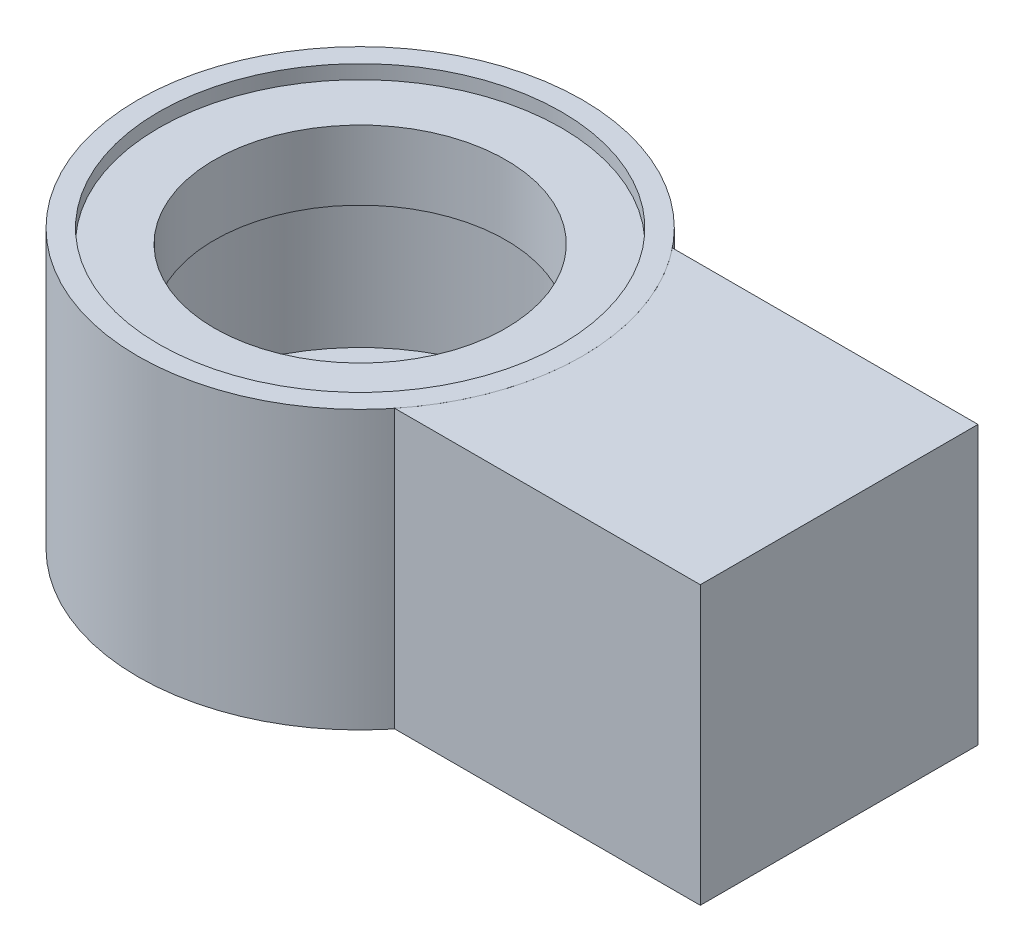
ISO-10303-21;
HEADER;
FILE_DESCRIPTION(('STEP AP214'),'2;1');
FILE_NAME('part.step','',(''),(''),'','','');
FILE_SCHEMA(('AUTOMOTIVE_DESIGN { 1 0 10303 214 1 1 1 1 }'));
ENDSEC;
DATA;
#1=APPLICATION_CONTEXT('core data for automotive mechanical design processes');
#2=APPLICATION_PROTOCOL_DEFINITION('international standard','automotive_design',2000,#1);
#3=PRODUCT_CONTEXT('',#1,'mechanical');
#4=PRODUCT('Part','Part','',(#3));
#5=PRODUCT_RELATED_PRODUCT_CATEGORY('part','',(#4));
#6=PRODUCT_DEFINITION_FORMATION('','',#4);
#7=PRODUCT_DEFINITION_CONTEXT('part definition',#1,'design');
#8=PRODUCT_DEFINITION('design','',#6,#7);
#9=PRODUCT_DEFINITION_SHAPE('','',#8);
#10=(LENGTH_UNIT() NAMED_UNIT(*) SI_UNIT(.MILLI.,.METRE.));
#11=(NAMED_UNIT(*) PLANE_ANGLE_UNIT() SI_UNIT($,.RADIAN.));
#12=(NAMED_UNIT(*) SI_UNIT($,.STERADIAN.) SOLID_ANGLE_UNIT());
#13=UNCERTAINTY_MEASURE_WITH_UNIT(LENGTH_MEASURE(1.E-05),#10,'distance_accuracy_value','');
#14=(GEOMETRIC_REPRESENTATION_CONTEXT(3) GLOBAL_UNCERTAINTY_ASSIGNED_CONTEXT((#13)) GLOBAL_UNIT_ASSIGNED_CONTEXT((#10,
#11,#12)) REPRESENTATION_CONTEXT('',''));
#15=CARTESIAN_POINT('',(0.,0.,0.));
#16=DIRECTION('',(0.,0.,1.));
#17=DIRECTION('',(1.,0.,0.));
#18=AXIS2_PLACEMENT_3D('',#15,#16,#17);
#19=CARTESIAN_POINT('',(175.26,101.6,30.48));
#20=DIRECTION('',(0.,0.,-1.));
#21=DIRECTION('',(0.,1.,0.));
#22=AXIS2_PLACEMENT_3D('',#19,#20,#21);
#23=PLANE('',#22);
#24=DIRECTION('',(-1.,0.,0.));
#25=VECTOR('',#24,1.);
#26=CARTESIAN_POINT('',(175.26,101.6,30.48));
#27=LINE('',#26,#25);
#28=CARTESIAN_POINT('',(175.26,101.6,30.48));
#29=VERTEX_POINT('',#28);
#30=CARTESIAN_POINT('',(63.4491796637277,101.6,30.48));
#31=VERTEX_POINT('',#30);
#32=EDGE_CURVE('E104',#29,#31,#27,.T.);
#33=ORIENTED_EDGE('',*,*,#32,.T.);
#34=DIRECTION('',(0.,1.,0.));
#35=VECTOR('',#34,1.);
#36=CARTESIAN_POINT('',(63.4491796637277,101.6,30.48));
#37=LINE('',#36,#35);
#38=CARTESIAN_POINT('',(63.4491796637277,0.,30.48));
#39=VERTEX_POINT('',#38);
#40=EDGE_CURVE('E99',#39,#31,#37,.T.);
#41=ORIENTED_EDGE('',*,*,#40,.F.);
#42=DIRECTION('',(-1.,0.,0.));
#43=VECTOR('',#42,1.);
#44=CARTESIAN_POINT('',(175.26,0.,30.48));
#45=LINE('',#44,#43);
#46=CARTESIAN_POINT('',(175.26,0.,30.48));
#47=VERTEX_POINT('',#46);
#48=EDGE_CURVE('E12',#47,#39,#45,.T.);
#49=ORIENTED_EDGE('',*,*,#48,.F.);
#50=DIRECTION('',(0.,-1.,0.));
#51=VECTOR('',#50,1.);
#52=CARTESIAN_POINT('',(175.26,101.6,30.48));
#53=LINE('',#52,#51);
#54=EDGE_CURVE('E109',#29,#47,#53,.T.);
#55=ORIENTED_EDGE('',*,*,#54,.F.);
#56=EDGE_LOOP('',(#33,#41,#49,#55));
#57=FACE_BOUND('',#56,.T.);
#58=ADVANCED_FACE('F47',(#57),#23,.F.);
#59=CARTESIAN_POINT('',(175.26,0.,30.48));
#60=DIRECTION('',(0.,1.,0.));
#61=DIRECTION('',(0.,0.,1.));
#62=AXIS2_PLACEMENT_3D('',#59,#60,#61);
#63=PLANE('',#62);
#64=ORIENTED_EDGE('',*,*,#48,.T.);
#65=CARTESIAN_POINT('',(0.,0.,-20.32));
#66=DIRECTION('',(0.,-1.,0.));
#67=DIRECTION('',(0.,0.,-1.));
#68=AXIS2_PLACEMENT_3D('',#65,#66,#67);
#69=CIRCLE('',#68,81.28);
#70=CARTESIAN_POINT('',(63.4491796637277,0.,-71.12));
#71=VERTEX_POINT('',#70);
#72=EDGE_CURVE('E89',#71,#39,#69,.T.);
#73=ORIENTED_EDGE('',*,*,#72,.F.);
#74=DIRECTION('',(-1.,0.,0.));
#75=VECTOR('',#74,1.);
#76=CARTESIAN_POINT('',(175.26,0.,-71.12));
#77=LINE('',#76,#75);
#78=CARTESIAN_POINT('',(175.26,0.,-71.12));
#79=VERTEX_POINT('',#78);
#80=EDGE_CURVE('E54',#79,#71,#77,.T.);
#81=ORIENTED_EDGE('',*,*,#80,.F.);
#82=DIRECTION('',(0.,0.,-1.));
#83=VECTOR('',#82,1.);
#84=CARTESIAN_POINT('',(175.26,0.,30.48));
#85=LINE('',#84,#83);
#86=EDGE_CURVE('E90',#47,#79,#85,.T.);
#87=ORIENTED_EDGE('',*,*,#86,.F.);
#88=EDGE_LOOP('',(#64,#73,#81,#87));
#89=FACE_BOUND('',#88,.T.);
#90=ADVANCED_FACE('F87',(#89),#63,.F.);
#91=CARTESIAN_POINT('',(175.26,101.6,-71.12));
#92=DIRECTION('',(0.,0.,1.));
#93=DIRECTION('',(0.,-1.,0.));
#94=AXIS2_PLACEMENT_3D('',#91,#92,#93);
#95=PLANE('',#94);
#96=ORIENTED_EDGE('',*,*,#80,.T.);
#97=DIRECTION('',(0.,1.,0.));
#98=VECTOR('',#97,1.);
#99=CARTESIAN_POINT('',(63.4491796637277,101.6,-71.12));
#100=LINE('',#99,#98);
#101=CARTESIAN_POINT('',(63.4491796637277,101.6,-71.12));
#102=VERTEX_POINT('',#101);
#103=EDGE_CURVE('E101',#102,#71,#100,.F.);
#104=ORIENTED_EDGE('',*,*,#103,.F.);
#105=DIRECTION('',(-1.,0.,0.));
#106=VECTOR('',#105,1.);
#107=CARTESIAN_POINT('',(175.26,101.6,-71.12));
#108=LINE('',#107,#106);
#109=CARTESIAN_POINT('',(175.26,101.6,-71.12));
#110=VERTEX_POINT('',#109);
#111=EDGE_CURVE('E116',#110,#102,#108,.T.);
#112=ORIENTED_EDGE('',*,*,#111,.F.);
#113=DIRECTION('',(0.,1.,0.));
#114=VECTOR('',#113,1.);
#115=CARTESIAN_POINT('',(175.26,101.6,-71.12));
#116=LINE('',#115,#114);
#117=EDGE_CURVE('E66',#79,#110,#116,.T.);
#118=ORIENTED_EDGE('',*,*,#117,.F.);
#119=EDGE_LOOP('',(#96,#104,#112,#118));
#120=FACE_BOUND('',#119,.T.);
#121=ADVANCED_FACE('F118',(#120),#95,.F.);
#122=CARTESIAN_POINT('',(175.26,101.6,30.48));
#123=DIRECTION('',(0.,-1.,0.));
#124=DIRECTION('',(0.,0.,-1.));
#125=AXIS2_PLACEMENT_3D('',#122,#123,#124);
#126=PLANE('',#125);
#127=ORIENTED_EDGE('',*,*,#111,.T.);
#128=CARTESIAN_POINT('',(0.,101.6,-20.32));
#129=DIRECTION('',(0.,1.,0.));
#130=DIRECTION('',(0.,0.,1.));
#131=AXIS2_PLACEMENT_3D('',#128,#129,#130);
#132=CIRCLE('',#131,81.28);
#133=EDGE_CURVE('E102',#31,#102,#132,.T.);
#134=ORIENTED_EDGE('',*,*,#133,.F.);
#135=ORIENTED_EDGE('',*,*,#32,.F.);
#136=DIRECTION('',(0.,0.,1.));
#137=VECTOR('',#136,1.);
#138=CARTESIAN_POINT('',(175.26,101.6,30.48));
#139=LINE('',#138,#137);
#140=EDGE_CURVE('E61',#110,#29,#139,.T.);
#141=ORIENTED_EDGE('',*,*,#140,.F.);
#142=EDGE_LOOP('',(#127,#134,#135,#141));
#143=FACE_BOUND('',#142,.T.);
#144=ADVANCED_FACE('F120',(#143),#126,.F.);
#145=CARTESIAN_POINT('',(175.26,0.,0.));
#146=DIRECTION('',(1.,0.,0.));
#147=DIRECTION('',(0.,0.,-1.));
#148=AXIS2_PLACEMENT_3D('',#145,#146,#147);
#149=PLANE('',#148);
#150=ORIENTED_EDGE('',*,*,#54,.T.);
#151=ORIENTED_EDGE('',*,*,#86,.T.);
#152=ORIENTED_EDGE('',*,*,#117,.T.);
#153=ORIENTED_EDGE('',*,*,#140,.T.);
#154=EDGE_LOOP('',(#150,#151,#152,#153));
#155=FACE_BOUND('',#154,.T.);
#156=ADVANCED_FACE('F121',(#155),#149,.T.);
#157=CARTESIAN_POINT('',(0.,101.6,-20.32));
#158=DIRECTION('',(0.,1.,0.));
#159=DIRECTION('',(0.,0.,1.));
#160=AXIS2_PLACEMENT_3D('',#157,#158,#159);
#161=CYLINDRICAL_SURFACE('',#160,81.28);
#162=ORIENTED_EDGE('',*,*,#103,.T.);
#163=ORIENTED_EDGE('',*,*,#72,.T.);
#164=ORIENTED_EDGE('',*,*,#40,.T.);
#165=ORIENTED_EDGE('',*,*,#133,.T.);
#166=EDGE_LOOP('',(#162,#163,#164,#165));
#167=FACE_BOUND('',#166,.T.);
#168=ADVANCED_FACE('F97',(#167),#161,.F.);
#169=CLOSED_SHELL('',(#58,#90,#121,#144,#156,#168));
#170=MANIFOLD_SOLID_BREP('B2',#169);
#171=CARTESIAN_POINT('',(0.,101.6,53.34));
#172=DIRECTION('',(0.,1.,0.));
#173=DIRECTION('',(0.,0.,1.));
#174=AXIS2_PLACEMENT_3D('',#171,#172,#173);
#175=PLANE('',#174);
#176=CARTESIAN_POINT('',(0.,101.6,-20.32));
#177=DIRECTION('',(0.,1.,0.));
#178=DIRECTION('',(0.,0.,1.));
#179=AXIS2_PLACEMENT_3D('',#176,#177,#178);
#180=CIRCLE('',#179,81.28);
#181=CARTESIAN_POINT('',(0.,101.6,60.96));
#182=VERTEX_POINT('',#181);
#183=EDGE_CURVE('E46',#182,#182,#180,.T.);
#184=ORIENTED_EDGE('',*,*,#183,.T.);
#185=EDGE_LOOP('',(#184));
#186=FACE_BOUND('',#185,.T.);
#187=CARTESIAN_POINT('',(0.,101.6,-20.32));
#188=DIRECTION('',(0.,1.,0.));
#189=DIRECTION('',(0.,0.,1.));
#190=AXIS2_PLACEMENT_3D('',#187,#188,#189);
#191=CIRCLE('',#190,73.66);
#192=CARTESIAN_POINT('',(0.,101.6,53.34));
#193=VERTEX_POINT('',#192);
#194=EDGE_CURVE('E214',#193,#193,#191,.T.);
#195=ORIENTED_EDGE('',*,*,#194,.F.);
#196=EDGE_LOOP('',(#195));
#197=FACE_BOUND('',#196,.T.);
#198=ADVANCED_FACE('F174',(#186,#197),#175,.T.);
#199=CARTESIAN_POINT('',(0.,101.6,-20.32));
#200=DIRECTION('',(0.,1.,0.));
#201=DIRECTION('',(0.,0.,1.));
#202=AXIS2_PLACEMENT_3D('',#199,#200,#201);
#203=CYLINDRICAL_SURFACE('',#202,81.28);
#204=CARTESIAN_POINT('',(0.,0.,-20.32));
#205=DIRECTION('',(0.,1.,0.));
#206=DIRECTION('',(0.,0.,1.));
#207=AXIS2_PLACEMENT_3D('',#204,#205,#206);
#208=CIRCLE('',#207,81.28);
#209=CARTESIAN_POINT('',(0.,0.,60.96));
#210=VERTEX_POINT('',#209);
#211=EDGE_CURVE('E180',#210,#210,#208,.T.);
#212=ORIENTED_EDGE('',*,*,#211,.T.);
#213=EDGE_LOOP('',(#212));
#214=FACE_BOUND('',#213,.T.);
#215=ORIENTED_EDGE('',*,*,#183,.F.);
#216=EDGE_LOOP('',(#215));
#217=FACE_BOUND('',#216,.T.);
#218=ADVANCED_FACE('F222',(#214,#217),#203,.T.);
#219=CARTESIAN_POINT('',(0.,0.,60.96));
#220=DIRECTION('',(0.,-1.,0.));
#221=DIRECTION('',(0.,0.,-1.));
#222=AXIS2_PLACEMENT_3D('',#219,#220,#221);
#223=PLANE('',#222);
#224=CARTESIAN_POINT('',(0.,0.,-20.32));
#225=DIRECTION('',(0.,1.,0.));
#226=DIRECTION('',(0.,0.,1.));
#227=AXIS2_PLACEMENT_3D('',#224,#225,#226);
#228=CIRCLE('',#227,20.32);
#229=CARTESIAN_POINT('',(0.,0.,0.));
#230=VERTEX_POINT('',#229);
#231=EDGE_CURVE('E184',#230,#230,#228,.T.);
#232=ORIENTED_EDGE('',*,*,#231,.T.);
#233=EDGE_LOOP('',(#232));
#234=FACE_BOUND('',#233,.T.);
#235=ORIENTED_EDGE('',*,*,#211,.F.);
#236=EDGE_LOOP('',(#235));
#237=FACE_BOUND('',#236,.T.);
#238=ADVANCED_FACE('F226',(#234,#237),#223,.T.);
#239=CARTESIAN_POINT('',(0.,101.6,-20.32));
#240=DIRECTION('',(0.,1.,0.));
#241=DIRECTION('',(0.,0.,1.));
#242=AXIS2_PLACEMENT_3D('',#239,#240,#241);
#243=CYLINDRICAL_SURFACE('',#242,20.32);
#244=CARTESIAN_POINT('',(0.,10.16,-20.32));
#245=DIRECTION('',(0.,1.,0.));
#246=DIRECTION('',(0.,0.,1.));
#247=AXIS2_PLACEMENT_3D('',#244,#245,#246);
#248=CIRCLE('',#247,20.32);
#249=CARTESIAN_POINT('',(0.,10.16,0.));
#250=VERTEX_POINT('',#249);
#251=EDGE_CURVE('E188',#250,#250,#248,.T.);
#252=ORIENTED_EDGE('',*,*,#251,.T.);
#253=EDGE_LOOP('',(#252));
#254=FACE_BOUND('',#253,.T.);
#255=ORIENTED_EDGE('',*,*,#231,.F.);
#256=EDGE_LOOP('',(#255));
#257=FACE_BOUND('',#256,.T.);
#258=ADVANCED_FACE('F230',(#254,#257),#243,.F.);
#259=CARTESIAN_POINT('',(0.,10.16,0.));
#260=DIRECTION('',(0.,1.,0.));
#261=DIRECTION('',(0.,0.,1.));
#262=AXIS2_PLACEMENT_3D('',#259,#260,#261);
#263=PLANE('',#262);
#264=CARTESIAN_POINT('',(0.,10.16,-20.32));
#265=DIRECTION('',(0.,1.,0.));
#266=DIRECTION('',(0.,0.,1.));
#267=AXIS2_PLACEMENT_3D('',#264,#265,#266);
#268=CIRCLE('',#267,43.18);
#269=CARTESIAN_POINT('',(0.,10.16,22.86));
#270=VERTEX_POINT('',#269);
#271=EDGE_CURVE('E193',#270,#270,#268,.T.);
#272=ORIENTED_EDGE('',*,*,#271,.T.);
#273=EDGE_LOOP('',(#272));
#274=FACE_BOUND('',#273,.T.);
#275=ORIENTED_EDGE('',*,*,#251,.F.);
#276=EDGE_LOOP('',(#275));
#277=FACE_BOUND('',#276,.T.);
#278=ADVANCED_FACE('F237',(#274,#277),#263,.T.);
#279=CARTESIAN_POINT('',(0.,101.6,-20.32));
#280=DIRECTION('',(0.,1.,0.));
#281=DIRECTION('',(0.,0.,1.));
#282=AXIS2_PLACEMENT_3D('',#279,#280,#281);
#283=CYLINDRICAL_SURFACE('',#282,43.18);
#284=CARTESIAN_POINT('',(0.,15.24,-20.32));
#285=DIRECTION('',(0.,1.,0.));
#286=DIRECTION('',(0.,0.,1.));
#287=AXIS2_PLACEMENT_3D('',#284,#285,#286);
#288=CIRCLE('',#287,43.18);
#289=CARTESIAN_POINT('',(0.,15.24,22.86));
#290=VERTEX_POINT('',#289);
#291=EDGE_CURVE('E196',#290,#290,#288,.T.);
#292=ORIENTED_EDGE('',*,*,#291,.T.);
#293=EDGE_LOOP('',(#292));
#294=FACE_BOUND('',#293,.T.);
#295=ORIENTED_EDGE('',*,*,#271,.F.);
#296=EDGE_LOOP('',(#295));
#297=FACE_BOUND('',#296,.T.);
#298=ADVANCED_FACE('F241',(#294,#297),#283,.F.);
#299=CARTESIAN_POINT('',(0.,15.24,22.86));
#300=DIRECTION('',(0.,1.,0.));
#301=DIRECTION('',(0.,0.,1.));
#302=AXIS2_PLACEMENT_3D('',#299,#300,#301);
#303=PLANE('',#302);
#304=CARTESIAN_POINT('',(0.,15.24,-20.32));
#305=DIRECTION('',(0.,1.,0.));
#306=DIRECTION('',(0.,0.,1.));
#307=AXIS2_PLACEMENT_3D('',#304,#305,#306);
#308=CIRCLE('',#307,68.58);
#309=CARTESIAN_POINT('',(0.,15.24,48.26));
#310=VERTEX_POINT('',#309);
#311=EDGE_CURVE('E199',#310,#310,#308,.T.);
#312=ORIENTED_EDGE('',*,*,#311,.T.);
#313=EDGE_LOOP('',(#312));
#314=FACE_BOUND('',#313,.T.);
#315=ORIENTED_EDGE('',*,*,#291,.F.);
#316=EDGE_LOOP('',(#315));
#317=FACE_BOUND('',#316,.T.);
#318=ADVANCED_FACE('F245',(#314,#317),#303,.T.);
#319=CARTESIAN_POINT('',(0.,101.6,-20.32));
#320=DIRECTION('',(0.,1.,0.));
#321=DIRECTION('',(0.,0.,1.));
#322=AXIS2_PLACEMENT_3D('',#319,#320,#321);
#323=CYLINDRICAL_SURFACE('',#322,68.58);
#324=CARTESIAN_POINT('',(0.,71.12,-20.32));
#325=DIRECTION('',(0.,1.,0.));
#326=DIRECTION('',(0.,0.,1.));
#327=AXIS2_PLACEMENT_3D('',#324,#325,#326);
#328=CIRCLE('',#327,68.58);
#329=CARTESIAN_POINT('',(0.,71.12,48.26));
#330=VERTEX_POINT('',#329);
#331=EDGE_CURVE('E202',#330,#330,#328,.T.);
#332=ORIENTED_EDGE('',*,*,#331,.T.);
#333=EDGE_LOOP('',(#332));
#334=FACE_BOUND('',#333,.T.);
#335=ORIENTED_EDGE('',*,*,#311,.F.);
#336=EDGE_LOOP('',(#335));
#337=FACE_BOUND('',#336,.T.);
#338=ADVANCED_FACE('F249',(#334,#337),#323,.F.);
#339=CARTESIAN_POINT('',(0.,71.12,48.26));
#340=DIRECTION('',(0.,-1.,0.));
#341=DIRECTION('',(0.,0.,-1.));
#342=AXIS2_PLACEMENT_3D('',#339,#340,#341);
#343=PLANE('',#342);
#344=CARTESIAN_POINT('',(0.,71.12,-20.32));
#345=DIRECTION('',(0.,1.,0.));
#346=DIRECTION('',(0.,0.,1.));
#347=AXIS2_PLACEMENT_3D('',#344,#345,#346);
#348=CIRCLE('',#347,53.34);
#349=CARTESIAN_POINT('',(0.,71.12,33.02));
#350=VERTEX_POINT('',#349);
#351=EDGE_CURVE('E205',#350,#350,#348,.T.);
#352=ORIENTED_EDGE('',*,*,#351,.T.);
#353=EDGE_LOOP('',(#352));
#354=FACE_BOUND('',#353,.T.);
#355=ORIENTED_EDGE('',*,*,#331,.F.);
#356=EDGE_LOOP('',(#355));
#357=FACE_BOUND('',#356,.T.);
#358=ADVANCED_FACE('F253',(#354,#357),#343,.T.);
#359=CARTESIAN_POINT('',(0.,101.6,-20.32));
#360=DIRECTION('',(0.,1.,0.));
#361=DIRECTION('',(0.,0.,1.));
#362=AXIS2_PLACEMENT_3D('',#359,#360,#361);
#363=CYLINDRICAL_SURFACE('',#362,53.34);
#364=CARTESIAN_POINT('',(0.,96.52,-20.32));
#365=DIRECTION('',(0.,1.,0.));
#366=DIRECTION('',(0.,0.,1.));
#367=AXIS2_PLACEMENT_3D('',#364,#365,#366);
#368=CIRCLE('',#367,53.34);
#369=CARTESIAN_POINT('',(0.,96.52,33.02));
#370=VERTEX_POINT('',#369);
#371=EDGE_CURVE('E208',#370,#370,#368,.T.);
#372=ORIENTED_EDGE('',*,*,#371,.T.);
#373=EDGE_LOOP('',(#372));
#374=FACE_BOUND('',#373,.T.);
#375=ORIENTED_EDGE('',*,*,#351,.F.);
#376=EDGE_LOOP('',(#375));
#377=FACE_BOUND('',#376,.T.);
#378=ADVANCED_FACE('F257',(#374,#377),#363,.F.);
#379=CARTESIAN_POINT('',(0.,96.52,33.02));
#380=DIRECTION('',(0.,1.,0.));
#381=DIRECTION('',(0.,0.,1.));
#382=AXIS2_PLACEMENT_3D('',#379,#380,#381);
#383=PLANE('',#382);
#384=CARTESIAN_POINT('',(0.,96.52,-20.32));
#385=DIRECTION('',(0.,1.,0.));
#386=DIRECTION('',(0.,0.,1.));
#387=AXIS2_PLACEMENT_3D('',#384,#385,#386);
#388=CIRCLE('',#387,73.66);
#389=CARTESIAN_POINT('',(0.,96.52,53.34));
#390=VERTEX_POINT('',#389);
#391=EDGE_CURVE('E211',#390,#390,#388,.T.);
#392=ORIENTED_EDGE('',*,*,#391,.T.);
#393=EDGE_LOOP('',(#392));
#394=FACE_BOUND('',#393,.T.);
#395=ORIENTED_EDGE('',*,*,#371,.F.);
#396=EDGE_LOOP('',(#395));
#397=FACE_BOUND('',#396,.T.);
#398=ADVANCED_FACE('F261',(#394,#397),#383,.T.);
#399=CARTESIAN_POINT('',(0.,101.6,-20.32));
#400=DIRECTION('',(0.,1.,0.));
#401=DIRECTION('',(0.,0.,1.));
#402=AXIS2_PLACEMENT_3D('',#399,#400,#401);
#403=CYLINDRICAL_SURFACE('',#402,73.66);
#404=ORIENTED_EDGE('',*,*,#194,.T.);
#405=EDGE_LOOP('',(#404));
#406=FACE_BOUND('',#405,.T.);
#407=ORIENTED_EDGE('',*,*,#391,.F.);
#408=EDGE_LOOP('',(#407));
#409=FACE_BOUND('',#408,.T.);
#410=ADVANCED_FACE('F218',(#406,#409),#403,.F.);
#411=CLOSED_SHELL('',(#198,#218,#238,#258,#278,#298,#318,#338,#358,#378,#398,#410));
#412=MANIFOLD_SOLID_BREP('B6',#411);
#413=ADVANCED_BREP_SHAPE_REPRESENTATION('',(#18,#170,#412),#14);
#414=SHAPE_DEFINITION_REPRESENTATION(#9,#413);
ENDSEC;
END-ISO-10303-21;
